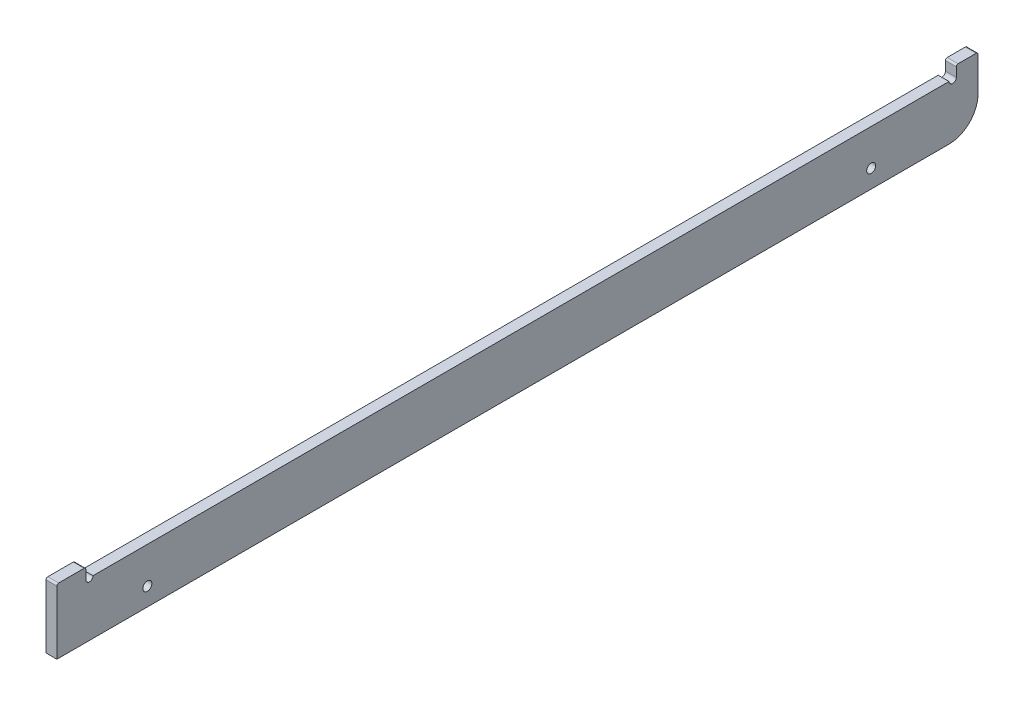
ISO-10303-21;
HEADER;
FILE_DESCRIPTION(('STEP AP214'),'2;1');
FILE_NAME('part.step','',(''),(''),'','','');
FILE_SCHEMA(('AUTOMOTIVE_DESIGN { 1 0 10303 214 1 1 1 1 }'));
ENDSEC;
DATA;
#1=APPLICATION_CONTEXT('core data for automotive mechanical design processes');
#2=APPLICATION_PROTOCOL_DEFINITION('international standard','automotive_design',2000,#1);
#3=PRODUCT_CONTEXT('',#1,'mechanical');
#4=PRODUCT('Part','Part','',(#3));
#5=PRODUCT_RELATED_PRODUCT_CATEGORY('part','',(#4));
#6=PRODUCT_DEFINITION_FORMATION('','',#4);
#7=PRODUCT_DEFINITION_CONTEXT('part definition',#1,'design');
#8=PRODUCT_DEFINITION('design','',#6,#7);
#9=PRODUCT_DEFINITION_SHAPE('','',#8);
#10=(LENGTH_UNIT() NAMED_UNIT(*) SI_UNIT(.MILLI.,.METRE.));
#11=(NAMED_UNIT(*) PLANE_ANGLE_UNIT() SI_UNIT($,.RADIAN.));
#12=(NAMED_UNIT(*) SI_UNIT($,.STERADIAN.) SOLID_ANGLE_UNIT());
#13=UNCERTAINTY_MEASURE_WITH_UNIT(LENGTH_MEASURE(1.E-05),#10,'distance_accuracy_value','');
#14=(GEOMETRIC_REPRESENTATION_CONTEXT(3) GLOBAL_UNCERTAINTY_ASSIGNED_CONTEXT((#13)) GLOBAL_UNIT_ASSIGNED_CONTEXT((#10,
#11,#12)) REPRESENTATION_CONTEXT('',''));
#15=CARTESIAN_POINT('',(0.,0.,0.));
#16=DIRECTION('',(0.,0.,1.));
#17=DIRECTION('',(1.,0.,0.));
#18=AXIS2_PLACEMENT_3D('',#15,#16,#17);
#19=CARTESIAN_POINT('',(3.,0.,0.));
#20=DIRECTION('',(0.,0.,-1.));
#21=DIRECTION('',(-1.,0.,0.));
#22=AXIS2_PLACEMENT_3D('',#19,#20,#21);
#23=PLANE('',#22);
#24=DIRECTION('',(0.,-1.,0.));
#25=VECTOR('',#24,1.);
#26=CARTESIAN_POINT('',(3.,0.,0.));
#27=LINE('',#26,#25);
#28=CARTESIAN_POINT('',(3.,17.4999999999995,0.));
#29=VERTEX_POINT('',#28);
#30=CARTESIAN_POINT('',(3.,0.,0.));
#31=VERTEX_POINT('',#30);
#32=EDGE_CURVE('E207',#29,#31,#27,.T.);
#33=ORIENTED_EDGE('',*,*,#32,.F.);
#34=DIRECTION('',(1.,0.,0.));
#35=VECTOR('',#34,1.);
#36=CARTESIAN_POINT('',(0.,17.4999999999995,0.));
#37=LINE('',#36,#35);
#38=CARTESIAN_POINT('',(0.,17.4999999999995,0.));
#39=VERTEX_POINT('',#38);
#40=EDGE_CURVE('E217',#29,#39,#37,.F.);
#41=ORIENTED_EDGE('',*,*,#40,.T.);
#42=DIRECTION('',(0.,-1.,0.));
#43=VECTOR('',#42,1.);
#44=CARTESIAN_POINT('',(0.,0.,0.));
#45=LINE('',#44,#43);
#46=CARTESIAN_POINT('',(0.,0.,0.));
#47=VERTEX_POINT('',#46);
#48=EDGE_CURVE('E184',#39,#47,#45,.T.);
#49=ORIENTED_EDGE('',*,*,#48,.T.);
#50=DIRECTION('',(-1.,0.,0.));
#51=VECTOR('',#50,1.);
#52=CARTESIAN_POINT('',(3.,0.,0.));
#53=LINE('',#52,#51);
#54=EDGE_CURVE('E166',#31,#47,#53,.T.);
#55=ORIENTED_EDGE('',*,*,#54,.F.);
#56=EDGE_LOOP('',(#33,#41,#49,#55));
#57=FACE_BOUND('',#56,.T.);
#58=ADVANCED_FACE('F33',(#57),#23,.F.);
#59=CARTESIAN_POINT('',(3.,0.,0.));
#60=DIRECTION('',(0.,1.,0.));
#61=DIRECTION('',(0.,0.,1.));
#62=AXIS2_PLACEMENT_3D('',#59,#60,#61);
#63=PLANE('',#62);
#64=DIRECTION('',(0.,0.,-1.));
#65=VECTOR('',#64,1.);
#66=CARTESIAN_POINT('',(0.,0.,0.));
#67=LINE('',#66,#65);
#68=CARTESIAN_POINT('',(0.,0.,-246.5));
#69=VERTEX_POINT('',#68);
#70=EDGE_CURVE('E186',#47,#69,#67,.T.);
#71=ORIENTED_EDGE('',*,*,#70,.T.);
#72=DIRECTION('',(-1.,0.,0.));
#73=VECTOR('',#72,1.);
#74=CARTESIAN_POINT('',(3.,0.,-246.5));
#75=LINE('',#74,#73);
#76=CARTESIAN_POINT('',(3.,0.,-246.5));
#77=VERTEX_POINT('',#76);
#78=EDGE_CURVE('E41',#69,#77,#75,.F.);
#79=ORIENTED_EDGE('',*,*,#78,.T.);
#80=DIRECTION('',(0.,0.,-1.));
#81=VECTOR('',#80,1.);
#82=CARTESIAN_POINT('',(3.,0.,0.));
#83=LINE('',#82,#81);
#84=EDGE_CURVE('E172',#31,#77,#83,.T.);
#85=ORIENTED_EDGE('',*,*,#84,.F.);
#86=ORIENTED_EDGE('',*,*,#54,.T.);
#87=EDGE_LOOP('',(#71,#79,#85,#86));
#88=FACE_BOUND('',#87,.T.);
#89=ADVANCED_FACE('F308',(#88),#63,.F.);
#90=CARTESIAN_POINT('',(3.,0.,-254.5));
#91=DIRECTION('',(0.,0.,1.));
#92=DIRECTION('',(1.,0.,0.));
#93=AXIS2_PLACEMENT_3D('',#90,#91,#92);
#94=PLANE('',#93);
#95=DIRECTION('',(0.,1.,0.));
#96=VECTOR('',#95,1.);
#97=CARTESIAN_POINT('',(3.,0.,-254.5));
#98=LINE('',#97,#96);
#99=CARTESIAN_POINT('',(3.,8.,-254.5));
#100=VERTEX_POINT('',#99);
#101=CARTESIAN_POINT('',(3.,17.4999999999995,-254.5));
#102=VERTEX_POINT('',#101);
#103=EDGE_CURVE('E167',#100,#102,#98,.T.);
#104=ORIENTED_EDGE('',*,*,#103,.F.);
#105=DIRECTION('',(-1.,0.,0.));
#106=VECTOR('',#105,1.);
#107=CARTESIAN_POINT('',(3.,8.,-254.5));
#108=LINE('',#107,#106);
#109=CARTESIAN_POINT('',(0.,8.,-254.5));
#110=VERTEX_POINT('',#109);
#111=EDGE_CURVE('E215',#100,#110,#108,.T.);
#112=ORIENTED_EDGE('',*,*,#111,.T.);
#113=DIRECTION('',(0.,1.,0.));
#114=VECTOR('',#113,1.);
#115=CARTESIAN_POINT('',(0.,0.,-254.5));
#116=LINE('',#115,#114);
#117=CARTESIAN_POINT('',(0.,17.4999999999995,-254.5));
#118=VERTEX_POINT('',#117);
#119=EDGE_CURVE('E189',#110,#118,#116,.T.);
#120=ORIENTED_EDGE('',*,*,#119,.T.);
#121=DIRECTION('',(1.,0.,0.));
#122=VECTOR('',#121,1.);
#123=CARTESIAN_POINT('',(3.,17.4999999999995,-254.5));
#124=LINE('',#123,#122);
#125=EDGE_CURVE('E170',#118,#102,#124,.T.);
#126=ORIENTED_EDGE('',*,*,#125,.T.);
#127=EDGE_LOOP('',(#104,#112,#120,#126));
#128=FACE_BOUND('',#127,.T.);
#129=ADVANCED_FACE('F262',(#128),#94,.F.);
#130=CARTESIAN_POINT('',(3.,15.,0.));
#131=DIRECTION('',(0.,-1.,0.));
#132=DIRECTION('',(0.,0.,-1.));
#133=AXIS2_PLACEMENT_3D('',#130,#131,#132);
#134=PLANE('',#133);
#135=DIRECTION('',(0.,0.,1.));
#136=VECTOR('',#135,1.);
#137=CARTESIAN_POINT('',(3.,15.,0.));
#138=LINE('',#137,#136);
#139=CARTESIAN_POINT('',(3.,15.,-246.5));
#140=VERTEX_POINT('',#139);
#141=CARTESIAN_POINT('',(3.,15.,-10.));
#142=VERTEX_POINT('',#141);
#143=EDGE_CURVE('E156',#140,#142,#138,.T.);
#144=ORIENTED_EDGE('',*,*,#143,.F.);
#145=DIRECTION('',(1.,0.,0.));
#146=VECTOR('',#145,1.);
#147=CARTESIAN_POINT('',(0.,15.,-246.5));
#148=LINE('',#147,#146);
#149=CARTESIAN_POINT('',(0.,15.,-246.5));
#150=VERTEX_POINT('',#149);
#151=EDGE_CURVE('E140',#140,#150,#148,.F.);
#152=ORIENTED_EDGE('',*,*,#151,.T.);
#153=DIRECTION('',(0.,0.,1.));
#154=VECTOR('',#153,1.);
#155=CARTESIAN_POINT('',(0.,15.,0.));
#156=LINE('',#155,#154);
#157=CARTESIAN_POINT('',(0.,15.,-10.));
#158=VERTEX_POINT('',#157);
#159=EDGE_CURVE('E177',#150,#158,#156,.T.);
#160=ORIENTED_EDGE('',*,*,#159,.T.);
#161=DIRECTION('',(1.,0.,0.));
#162=VECTOR('',#161,1.);
#163=CARTESIAN_POINT('',(0.,15.,-10.));
#164=LINE('',#163,#162);
#165=EDGE_CURVE('E165',#158,#142,#164,.T.);
#166=ORIENTED_EDGE('',*,*,#165,.T.);
#167=EDGE_LOOP('',(#144,#152,#160,#166));
#168=FACE_BOUND('',#167,.T.);
#169=ADVANCED_FACE('F163',(#168),#134,.F.);
#170=CARTESIAN_POINT('',(3.,0.,0.));
#171=DIRECTION('',(-1.,0.,0.));
#172=DIRECTION('',(0.,0.,1.));
#173=AXIS2_PLACEMENT_3D('',#170,#171,#172);
#174=PLANE('',#173);
#175=CARTESIAN_POINT('',(3.,5.00000000000005,-25.));
#176=DIRECTION('',(1.,0.,0.));
#177=DIRECTION('',(0.,0.,-1.));
#178=AXIS2_PLACEMENT_3D('',#175,#176,#177);
#179=CIRCLE('',#178,1.25);
#180=CARTESIAN_POINT('',(3.,5.00000000000005,-26.25));
#181=VERTEX_POINT('',#180);
#182=EDGE_CURVE('E227',#181,#181,#179,.T.);
#183=ORIENTED_EDGE('',*,*,#182,.F.);
#184=EDGE_LOOP('',(#183));
#185=FACE_BOUND('',#184,.T.);
#186=CARTESIAN_POINT('',(3.,5.00000000000008,-225.));
#187=DIRECTION('',(1.,0.,0.));
#188=DIRECTION('',(0.,0.,-1.));
#189=AXIS2_PLACEMENT_3D('',#186,#187,#188);
#190=CIRCLE('',#189,1.25000000000001);
#191=CARTESIAN_POINT('',(3.,5.00000000000008,-226.25));
#192=VERTEX_POINT('',#191);
#193=EDGE_CURVE('E226',#192,#192,#190,.T.);
#194=ORIENTED_EDGE('',*,*,#193,.F.);
#195=EDGE_LOOP('',(#194));
#196=FACE_BOUND('',#195,.T.);
#197=ORIENTED_EDGE('',*,*,#84,.T.);
#198=CARTESIAN_POINT('',(3.,8.,-246.5));
#199=DIRECTION('',(-1.,0.,0.));
#200=DIRECTION('',(0.,0.,1.));
#201=AXIS2_PLACEMENT_3D('',#198,#199,#200);
#202=CIRCLE('',#201,8.);
#203=EDGE_CURVE('E11',#77,#100,#202,.F.);
#204=ORIENTED_EDGE('',*,*,#203,.T.);
#205=ORIENTED_EDGE('',*,*,#103,.T.);
#206=CARTESIAN_POINT('',(3.,17.4999999999995,-254.));
#207=DIRECTION('',(-1.,0.,0.));
#208=DIRECTION('',(0.,0.,1.));
#209=AXIS2_PLACEMENT_3D('',#206,#207,#208);
#210=CIRCLE('',#209,0.5);
#211=CARTESIAN_POINT('',(3.,17.9999999999995,-254.));
#212=VERTEX_POINT('',#211);
#213=EDGE_CURVE('E253',#102,#212,#210,.F.);
#214=ORIENTED_EDGE('',*,*,#213,.T.);
#215=DIRECTION('',(0.,0.,1.));
#216=VECTOR('',#215,1.);
#217=CARTESIAN_POINT('',(3.,17.9999999999995,-254.5));
#218=LINE('',#217,#216);
#219=CARTESIAN_POINT('',(3.,17.9999999999995,-249.));
#220=VERTEX_POINT('',#219);
#221=EDGE_CURVE('E270',#212,#220,#218,.T.);
#222=ORIENTED_EDGE('',*,*,#221,.T.);
#223=CARTESIAN_POINT('',(3.,17.4999999999995,-249.));
#224=DIRECTION('',(-1.,0.,0.));
#225=DIRECTION('',(0.,0.,1.));
#226=AXIS2_PLACEMENT_3D('',#223,#224,#225);
#227=CIRCLE('',#226,0.5);
#228=CARTESIAN_POINT('',(3.,17.4999999999995,-248.5));
#229=VERTEX_POINT('',#228);
#230=EDGE_CURVE('E255',#220,#229,#227,.F.);
#231=ORIENTED_EDGE('',*,*,#230,.T.);
#232=DIRECTION('',(0.,-1.,0.));
#233=VECTOR('',#232,1.);
#234=CARTESIAN_POINT('',(3.,15.,-248.5));
#235=LINE('',#234,#233);
#236=CARTESIAN_POINT('',(3.,15.,-248.5));
#237=VERTEX_POINT('',#236);
#238=EDGE_CURVE('E159',#229,#237,#235,.T.);
#239=ORIENTED_EDGE('',*,*,#238,.T.);
#240=CARTESIAN_POINT('',(3.,15.,-247.5));
#241=DIRECTION('',(1.,0.,0.));
#242=DIRECTION('',(0.,0.,-1.));
#243=AXIS2_PLACEMENT_3D('',#240,#241,#242);
#244=CIRCLE('',#243,0.999999999999998);
#245=EDGE_CURVE('E144',#140,#237,#244,.T.);
#246=ORIENTED_EDGE('',*,*,#245,.F.);
#247=ORIENTED_EDGE('',*,*,#143,.T.);
#248=CARTESIAN_POINT('',(3.,15.,-9.));
#249=DIRECTION('',(1.,0.,0.));
#250=DIRECTION('',(0.,0.,-1.));
#251=AXIS2_PLACEMENT_3D('',#248,#249,#250);
#252=CIRCLE('',#251,1.);
#253=CARTESIAN_POINT('',(3.,15.,-8.));
#254=VERTEX_POINT('',#253);
#255=EDGE_CURVE('E151',#254,#142,#252,.T.);
#256=ORIENTED_EDGE('',*,*,#255,.F.);
#257=DIRECTION('',(0.,1.,0.));
#258=VECTOR('',#257,1.);
#259=CARTESIAN_POINT('',(3.,15.,-8.));
#260=LINE('',#259,#258);
#261=CARTESIAN_POINT('',(3.,17.4999999999995,-8.));
#262=VERTEX_POINT('',#261);
#263=EDGE_CURVE('E192',#254,#262,#260,.T.);
#264=ORIENTED_EDGE('',*,*,#263,.T.);
#265=CARTESIAN_POINT('',(3.,17.4999999999995,-7.5));
#266=DIRECTION('',(-1.,0.,0.));
#267=DIRECTION('',(0.,0.,1.));
#268=AXIS2_PLACEMENT_3D('',#265,#266,#267);
#269=CIRCLE('',#268,0.5);
#270=CARTESIAN_POINT('',(3.,17.9999999999995,-7.5));
#271=VERTEX_POINT('',#270);
#272=EDGE_CURVE('E257',#262,#271,#269,.F.);
#273=ORIENTED_EDGE('',*,*,#272,.T.);
#274=DIRECTION('',(0.,0.,1.));
#275=VECTOR('',#274,1.);
#276=CARTESIAN_POINT('',(3.,17.9999999999995,0.));
#277=LINE('',#276,#275);
#278=CARTESIAN_POINT('',(3.,17.9999999999995,-0.5));
#279=VERTEX_POINT('',#278);
#280=EDGE_CURVE('E195',#271,#279,#277,.T.);
#281=ORIENTED_EDGE('',*,*,#280,.T.);
#282=CARTESIAN_POINT('',(3.,17.4999999999995,-0.5));
#283=DIRECTION('',(-1.,0.,0.));
#284=DIRECTION('',(0.,0.,1.));
#285=AXIS2_PLACEMENT_3D('',#282,#283,#284);
#286=CIRCLE('',#285,0.5);
#287=EDGE_CURVE('E258',#279,#29,#286,.F.);
#288=ORIENTED_EDGE('',*,*,#287,.T.);
#289=ORIENTED_EDGE('',*,*,#32,.T.);
#290=EDGE_LOOP('',(#197,#204,#205,#214,#222,#231,#239,#246,#247,#256,#264,#273,#281,#288,#289));
#291=FACE_BOUND('',#290,.T.);
#292=ADVANCED_FACE('F154',(#185,#196,#291),#174,.F.);
#293=CARTESIAN_POINT('',(0.,0.,0.));
#294=DIRECTION('',(-1.,0.,0.));
#295=DIRECTION('',(0.,0.,1.));
#296=AXIS2_PLACEMENT_3D('',#293,#294,#295);
#297=PLANE('',#296);
#298=CARTESIAN_POINT('',(0.,5.00000000000005,-25.));
#299=DIRECTION('',(-1.,0.,0.));
#300=DIRECTION('',(0.,0.,1.));
#301=AXIS2_PLACEMENT_3D('',#298,#299,#300);
#302=CIRCLE('',#301,1.25);
#303=CARTESIAN_POINT('',(0.,5.00000000000005,-23.75));
#304=VERTEX_POINT('',#303);
#305=EDGE_CURVE('E223',#304,#304,#302,.T.);
#306=ORIENTED_EDGE('',*,*,#305,.F.);
#307=EDGE_LOOP('',(#306));
#308=FACE_BOUND('',#307,.T.);
#309=CARTESIAN_POINT('',(0.,5.00000000000008,-225.));
#310=DIRECTION('',(-1.,0.,0.));
#311=DIRECTION('',(0.,0.,1.));
#312=AXIS2_PLACEMENT_3D('',#309,#310,#311);
#313=CIRCLE('',#312,1.25000000000001);
#314=CARTESIAN_POINT('',(0.,5.00000000000008,-223.75));
#315=VERTEX_POINT('',#314);
#316=EDGE_CURVE('E160',#315,#315,#313,.T.);
#317=ORIENTED_EDGE('',*,*,#316,.F.);
#318=EDGE_LOOP('',(#317));
#319=FACE_BOUND('',#318,.T.);
#320=ORIENTED_EDGE('',*,*,#119,.F.);
#321=CARTESIAN_POINT('',(0.,8.,-246.5));
#322=DIRECTION('',(-1.,0.,0.));
#323=DIRECTION('',(0.,0.,1.));
#324=AXIS2_PLACEMENT_3D('',#321,#322,#323);
#325=CIRCLE('',#324,8.);
#326=EDGE_CURVE('E55',#110,#69,#325,.T.);
#327=ORIENTED_EDGE('',*,*,#326,.T.);
#328=ORIENTED_EDGE('',*,*,#70,.F.);
#329=ORIENTED_EDGE('',*,*,#48,.F.);
#330=CARTESIAN_POINT('',(0.,17.4999999999995,-0.5));
#331=DIRECTION('',(-1.,0.,0.));
#332=DIRECTION('',(0.,0.,1.));
#333=AXIS2_PLACEMENT_3D('',#330,#331,#332);
#334=CIRCLE('',#333,0.5);
#335=CARTESIAN_POINT('',(0.,17.9999999999995,-0.5));
#336=VERTEX_POINT('',#335);
#337=EDGE_CURVE('E246',#39,#336,#334,.T.);
#338=ORIENTED_EDGE('',*,*,#337,.T.);
#339=DIRECTION('',(0.,0.,1.));
#340=VECTOR('',#339,1.);
#341=CARTESIAN_POINT('',(0.,17.9999999999995,0.));
#342=LINE('',#341,#340);
#343=CARTESIAN_POINT('',(0.,17.9999999999995,-7.5));
#344=VERTEX_POINT('',#343);
#345=EDGE_CURVE('E201',#344,#336,#342,.T.);
#346=ORIENTED_EDGE('',*,*,#345,.F.);
#347=CARTESIAN_POINT('',(0.,17.4999999999995,-7.5));
#348=DIRECTION('',(-1.,0.,0.));
#349=DIRECTION('',(0.,0.,1.));
#350=AXIS2_PLACEMENT_3D('',#347,#348,#349);
#351=CIRCLE('',#350,0.5);
#352=CARTESIAN_POINT('',(0.,17.4999999999995,-8.));
#353=VERTEX_POINT('',#352);
#354=EDGE_CURVE('E244',#344,#353,#351,.T.);
#355=ORIENTED_EDGE('',*,*,#354,.T.);
#356=DIRECTION('',(0.,1.,0.));
#357=VECTOR('',#356,1.);
#358=CARTESIAN_POINT('',(0.,15.,-8.));
#359=LINE('',#358,#357);
#360=CARTESIAN_POINT('',(0.,15.,-8.));
#361=VERTEX_POINT('',#360);
#362=EDGE_CURVE('E202',#361,#353,#359,.T.);
#363=ORIENTED_EDGE('',*,*,#362,.F.);
#364=CARTESIAN_POINT('',(0.,15.,-9.));
#365=DIRECTION('',(1.,0.,0.));
#366=DIRECTION('',(0.,0.,-1.));
#367=AXIS2_PLACEMENT_3D('',#364,#365,#366);
#368=CIRCLE('',#367,1.);
#369=EDGE_CURVE('E279',#361,#158,#368,.T.);
#370=ORIENTED_EDGE('',*,*,#369,.T.);
#371=ORIENTED_EDGE('',*,*,#159,.F.);
#372=CARTESIAN_POINT('',(0.,15.,-247.5));
#373=DIRECTION('',(1.,0.,0.));
#374=DIRECTION('',(0.,0.,-1.));
#375=AXIS2_PLACEMENT_3D('',#372,#373,#374);
#376=CIRCLE('',#375,0.999999999999998);
#377=CARTESIAN_POINT('',(0.,15.,-248.5));
#378=VERTEX_POINT('',#377);
#379=EDGE_CURVE('E147',#150,#378,#376,.T.);
#380=ORIENTED_EDGE('',*,*,#379,.T.);
#381=DIRECTION('',(0.,-1.,0.));
#382=VECTOR('',#381,1.);
#383=CARTESIAN_POINT('',(0.,15.,-248.5));
#384=LINE('',#383,#382);
#385=CARTESIAN_POINT('',(0.,17.4999999999995,-248.5));
#386=VERTEX_POINT('',#385);
#387=EDGE_CURVE('E282',#386,#378,#384,.T.);
#388=ORIENTED_EDGE('',*,*,#387,.F.);
#389=CARTESIAN_POINT('',(0.,17.4999999999995,-249.));
#390=DIRECTION('',(-1.,0.,0.));
#391=DIRECTION('',(0.,0.,1.));
#392=AXIS2_PLACEMENT_3D('',#389,#390,#391);
#393=CIRCLE('',#392,0.5);
#394=CARTESIAN_POINT('',(0.,17.9999999999995,-249.));
#395=VERTEX_POINT('',#394);
#396=EDGE_CURVE('E242',#386,#395,#393,.T.);
#397=ORIENTED_EDGE('',*,*,#396,.T.);
#398=DIRECTION('',(0.,0.,1.));
#399=VECTOR('',#398,1.);
#400=CARTESIAN_POINT('',(0.,17.9999999999995,-254.5));
#401=LINE('',#400,#399);
#402=CARTESIAN_POINT('',(0.,17.9999999999995,-254.));
#403=VERTEX_POINT('',#402);
#404=EDGE_CURVE('E277',#403,#395,#401,.T.);
#405=ORIENTED_EDGE('',*,*,#404,.F.);
#406=CARTESIAN_POINT('',(0.,17.4999999999995,-254.));
#407=DIRECTION('',(-1.,0.,0.));
#408=DIRECTION('',(0.,0.,1.));
#409=AXIS2_PLACEMENT_3D('',#406,#407,#408);
#410=CIRCLE('',#409,0.5);
#411=EDGE_CURVE('E239',#403,#118,#410,.T.);
#412=ORIENTED_EDGE('',*,*,#411,.T.);
#413=EDGE_LOOP('',(#320,#327,#328,#329,#338,#346,#355,#363,#370,#371,#380,#388,#397,#405,#412));
#414=FACE_BOUND('',#413,.T.);
#415=ADVANCED_FACE('F300',(#308,#319,#414),#297,.T.);
#416=CARTESIAN_POINT('',(0.,17.9999999999995,0.));
#417=DIRECTION('',(0.,1.,0.));
#418=DIRECTION('',(0.,0.,1.));
#419=AXIS2_PLACEMENT_3D('',#416,#417,#418);
#420=PLANE('',#419);
#421=ORIENTED_EDGE('',*,*,#280,.F.);
#422=DIRECTION('',(1.,0.,0.));
#423=VECTOR('',#422,1.);
#424=CARTESIAN_POINT('',(0.,17.9999999999995,-7.5));
#425=LINE('',#424,#423);
#426=EDGE_CURVE('E220',#271,#344,#425,.F.);
#427=ORIENTED_EDGE('',*,*,#426,.T.);
#428=ORIENTED_EDGE('',*,*,#345,.T.);
#429=DIRECTION('',(1.,0.,0.));
#430=VECTOR('',#429,1.);
#431=CARTESIAN_POINT('',(3.,17.9999999999995,-0.5));
#432=LINE('',#431,#430);
#433=EDGE_CURVE('E231',#336,#279,#432,.T.);
#434=ORIENTED_EDGE('',*,*,#433,.T.);
#435=EDGE_LOOP('',(#421,#427,#428,#434));
#436=FACE_BOUND('',#435,.T.);
#437=ADVANCED_FACE('F296',(#436),#420,.T.);
#438=CARTESIAN_POINT('',(0.,15.,-8.));
#439=DIRECTION('',(0.,0.,-1.));
#440=DIRECTION('',(-1.,0.,0.));
#441=AXIS2_PLACEMENT_3D('',#438,#439,#440);
#442=PLANE('',#441);
#443=ORIENTED_EDGE('',*,*,#362,.T.);
#444=DIRECTION('',(1.,0.,0.));
#445=VECTOR('',#444,1.);
#446=CARTESIAN_POINT('',(0.,17.4999999999995,-8.));
#447=LINE('',#446,#445);
#448=EDGE_CURVE('E234',#353,#262,#447,.T.);
#449=ORIENTED_EDGE('',*,*,#448,.T.);
#450=ORIENTED_EDGE('',*,*,#263,.F.);
#451=DIRECTION('',(1.,0.,0.));
#452=VECTOR('',#451,1.);
#453=CARTESIAN_POINT('',(0.,15.,-8.));
#454=LINE('',#453,#452);
#455=EDGE_CURVE('E187',#361,#254,#454,.T.);
#456=ORIENTED_EDGE('',*,*,#455,.F.);
#457=EDGE_LOOP('',(#443,#449,#450,#456));
#458=FACE_BOUND('',#457,.T.);
#459=ADVANCED_FACE('F350',(#458),#442,.T.);
#460=CARTESIAN_POINT('',(0.,15.,-248.5));
#461=DIRECTION('',(0.,0.,1.));
#462=DIRECTION('',(1.,0.,0.));
#463=AXIS2_PLACEMENT_3D('',#460,#461,#462);
#464=PLANE('',#463);
#465=ORIENTED_EDGE('',*,*,#238,.F.);
#466=DIRECTION('',(1.,0.,0.));
#467=VECTOR('',#466,1.);
#468=CARTESIAN_POINT('',(0.,17.4999999999995,-248.5));
#469=LINE('',#468,#467);
#470=EDGE_CURVE('E237',#229,#386,#469,.F.);
#471=ORIENTED_EDGE('',*,*,#470,.T.);
#472=ORIENTED_EDGE('',*,*,#387,.T.);
#473=DIRECTION('',(1.,0.,0.));
#474=VECTOR('',#473,1.);
#475=CARTESIAN_POINT('',(0.,15.,-248.5));
#476=LINE('',#475,#474);
#477=EDGE_CURVE('E196',#378,#237,#476,.T.);
#478=ORIENTED_EDGE('',*,*,#477,.T.);
#479=EDGE_LOOP('',(#465,#471,#472,#478));
#480=FACE_BOUND('',#479,.T.);
#481=ADVANCED_FACE('F347',(#480),#464,.T.);
#482=CARTESIAN_POINT('',(0.,17.9999999999995,-254.5));
#483=DIRECTION('',(0.,1.,0.));
#484=DIRECTION('',(0.,0.,1.));
#485=AXIS2_PLACEMENT_3D('',#482,#483,#484);
#486=PLANE('',#485);
#487=ORIENTED_EDGE('',*,*,#221,.F.);
#488=DIRECTION('',(1.,0.,0.));
#489=VECTOR('',#488,1.);
#490=CARTESIAN_POINT('',(0.,17.9999999999995,-254.));
#491=LINE('',#490,#489);
#492=EDGE_CURVE('E248',#212,#403,#491,.F.);
#493=ORIENTED_EDGE('',*,*,#492,.T.);
#494=ORIENTED_EDGE('',*,*,#404,.T.);
#495=DIRECTION('',(1.,0.,0.));
#496=VECTOR('',#495,1.);
#497=CARTESIAN_POINT('',(0.,17.9999999999995,-249.));
#498=LINE('',#497,#496);
#499=EDGE_CURVE('E250',#395,#220,#498,.T.);
#500=ORIENTED_EDGE('',*,*,#499,.T.);
#501=EDGE_LOOP('',(#487,#493,#494,#500));
#502=FACE_BOUND('',#501,.T.);
#503=ADVANCED_FACE('F272',(#502),#486,.T.);
#504=CARTESIAN_POINT('',(0.,15.,-9.));
#505=DIRECTION('',(1.,0.,0.));
#506=DIRECTION('',(0.,0.,-1.));
#507=AXIS2_PLACEMENT_3D('',#504,#505,#506);
#508=CYLINDRICAL_SURFACE('',#507,1.);
#509=ORIENTED_EDGE('',*,*,#369,.F.);
#510=ORIENTED_EDGE('',*,*,#455,.T.);
#511=ORIENTED_EDGE('',*,*,#255,.T.);
#512=ORIENTED_EDGE('',*,*,#165,.F.);
#513=EDGE_LOOP('',(#509,#510,#511,#512));
#514=FACE_BOUND('',#513,.T.);
#515=ADVANCED_FACE('F343',(#514),#508,.F.);
#516=CARTESIAN_POINT('',(0.,15.,-247.5));
#517=DIRECTION('',(1.,0.,0.));
#518=DIRECTION('',(0.,0.,-1.));
#519=AXIS2_PLACEMENT_3D('',#516,#517,#518);
#520=CYLINDRICAL_SURFACE('',#519,0.999999999999998);
#521=ORIENTED_EDGE('',*,*,#245,.T.);
#522=ORIENTED_EDGE('',*,*,#477,.F.);
#523=ORIENTED_EDGE('',*,*,#379,.F.);
#524=ORIENTED_EDGE('',*,*,#151,.F.);
#525=EDGE_LOOP('',(#521,#522,#523,#524));
#526=FACE_BOUND('',#525,.T.);
#527=ADVANCED_FACE('F142',(#526),#520,.F.);
#528=CARTESIAN_POINT('',(3.,17.4999999999995,-254.));
#529=DIRECTION('',(-1.,0.,0.));
#530=DIRECTION('',(0.,0.,1.));
#531=AXIS2_PLACEMENT_3D('',#528,#529,#530);
#532=CYLINDRICAL_SURFACE('',#531,0.5);
#533=ORIENTED_EDGE('',*,*,#411,.F.);
#534=ORIENTED_EDGE('',*,*,#492,.F.);
#535=ORIENTED_EDGE('',*,*,#213,.F.);
#536=ORIENTED_EDGE('',*,*,#125,.F.);
#537=EDGE_LOOP('',(#533,#534,#535,#536));
#538=FACE_BOUND('',#537,.T.);
#539=ADVANCED_FACE('F266',(#538),#532,.T.);
#540=CARTESIAN_POINT('',(0.,17.4999999999995,-249.));
#541=DIRECTION('',(1.,0.,0.));
#542=DIRECTION('',(0.,0.,-1.));
#543=AXIS2_PLACEMENT_3D('',#540,#541,#542);
#544=CYLINDRICAL_SURFACE('',#543,0.5);
#545=ORIENTED_EDGE('',*,*,#396,.F.);
#546=ORIENTED_EDGE('',*,*,#470,.F.);
#547=ORIENTED_EDGE('',*,*,#230,.F.);
#548=ORIENTED_EDGE('',*,*,#499,.F.);
#549=EDGE_LOOP('',(#545,#546,#547,#548));
#550=FACE_BOUND('',#549,.T.);
#551=ADVANCED_FACE('F321',(#550),#544,.T.);
#552=CARTESIAN_POINT('',(0.,17.4999999999995,-7.5));
#553=DIRECTION('',(1.,0.,0.));
#554=DIRECTION('',(0.,0.,-1.));
#555=AXIS2_PLACEMENT_3D('',#552,#553,#554);
#556=CYLINDRICAL_SURFACE('',#555,0.5);
#557=ORIENTED_EDGE('',*,*,#354,.F.);
#558=ORIENTED_EDGE('',*,*,#426,.F.);
#559=ORIENTED_EDGE('',*,*,#272,.F.);
#560=ORIENTED_EDGE('',*,*,#448,.F.);
#561=EDGE_LOOP('',(#557,#558,#559,#560));
#562=FACE_BOUND('',#561,.T.);
#563=ADVANCED_FACE('F299',(#562),#556,.T.);
#564=CARTESIAN_POINT('',(0.,17.4999999999995,-0.5));
#565=DIRECTION('',(-1.,0.,0.));
#566=DIRECTION('',(0.,0.,1.));
#567=AXIS2_PLACEMENT_3D('',#564,#565,#566);
#568=CYLINDRICAL_SURFACE('',#567,0.5);
#569=ORIENTED_EDGE('',*,*,#337,.F.);
#570=ORIENTED_EDGE('',*,*,#40,.F.);
#571=ORIENTED_EDGE('',*,*,#287,.F.);
#572=ORIENTED_EDGE('',*,*,#433,.F.);
#573=EDGE_LOOP('',(#569,#570,#571,#572));
#574=FACE_BOUND('',#573,.T.);
#575=ADVANCED_FACE('F306',(#574),#568,.T.);
#576=CARTESIAN_POINT('',(-7.,5.00000000000008,-225.));
#577=DIRECTION('',(1.,0.,0.));
#578=DIRECTION('',(0.,0.,-1.));
#579=AXIS2_PLACEMENT_3D('',#576,#577,#578);
#580=CYLINDRICAL_SURFACE('',#579,1.25000000000001);
#581=ORIENTED_EDGE('',*,*,#316,.T.);
#582=EDGE_LOOP('',(#581));
#583=FACE_BOUND('',#582,.T.);
#584=ORIENTED_EDGE('',*,*,#193,.T.);
#585=EDGE_LOOP('',(#584));
#586=FACE_BOUND('',#585,.T.);
#587=ADVANCED_FACE('F327',(#583,#586),#580,.F.);
#588=CARTESIAN_POINT('',(-7.,5.00000000000005,-25.));
#589=DIRECTION('',(1.,0.,0.));
#590=DIRECTION('',(0.,0.,-1.));
#591=AXIS2_PLACEMENT_3D('',#588,#589,#590);
#592=CYLINDRICAL_SURFACE('',#591,1.25);
#593=ORIENTED_EDGE('',*,*,#305,.T.);
#594=EDGE_LOOP('',(#593));
#595=FACE_BOUND('',#594,.T.);
#596=ORIENTED_EDGE('',*,*,#182,.T.);
#597=EDGE_LOOP('',(#596));
#598=FACE_BOUND('',#597,.T.);
#599=ADVANCED_FACE('F331',(#595,#598),#592,.F.);
#600=CARTESIAN_POINT('',(3.,8.,-246.5));
#601=DIRECTION('',(-1.,0.,0.));
#602=DIRECTION('',(0.,0.,1.));
#603=AXIS2_PLACEMENT_3D('',#600,#601,#602);
#604=CYLINDRICAL_SURFACE('',#603,8.);
#605=ORIENTED_EDGE('',*,*,#203,.F.);
#606=ORIENTED_EDGE('',*,*,#78,.F.);
#607=ORIENTED_EDGE('',*,*,#326,.F.);
#608=ORIENTED_EDGE('',*,*,#111,.F.);
#609=EDGE_LOOP('',(#605,#606,#607,#608));
#610=FACE_BOUND('',#609,.T.);
#611=ADVANCED_FACE('F35',(#610),#604,.T.);
#612=CLOSED_SHELL('',(#58,#89,#129,#169,#292,#415,#437,#459,#481,#503,#515,#527,#539,#551,#563,
#575,#587,#599,#611));
#613=MANIFOLD_SOLID_BREP('B2',#612);
#614=ADVANCED_BREP_SHAPE_REPRESENTATION('',(#18,#613),#14);
#615=SHAPE_DEFINITION_REPRESENTATION(#9,#614);
ENDSEC;
END-ISO-10303-21;
